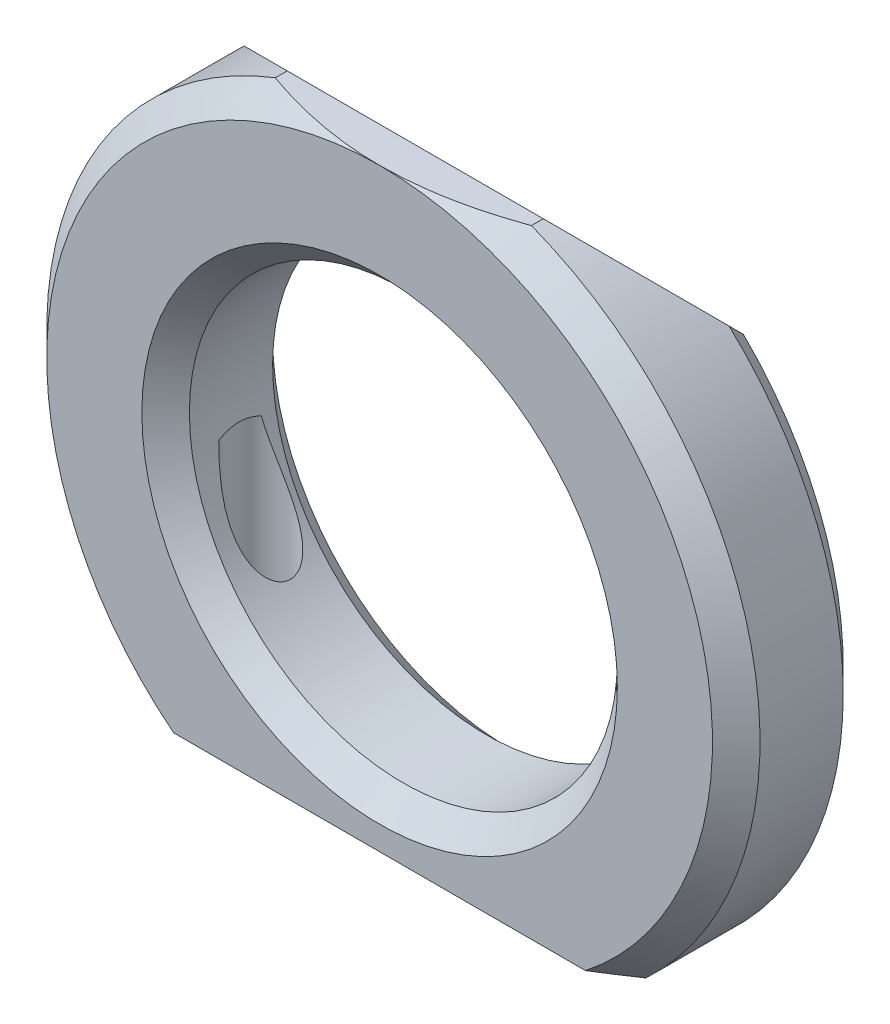
ISO-10303-21;
HEADER;
FILE_DESCRIPTION(('STEP AP214'),'2;1');
FILE_NAME('part.step','',(''),(''),'','','');
FILE_SCHEMA(('AUTOMOTIVE_DESIGN { 1 0 10303 214 1 1 1 1 }'));
ENDSEC;
DATA;
#1=APPLICATION_CONTEXT('core data for automotive mechanical design processes');
#2=APPLICATION_PROTOCOL_DEFINITION('international standard','automotive_design',2000,#1);
#3=PRODUCT_CONTEXT('',#1,'mechanical');
#4=PRODUCT('Part','Part','',(#3));
#5=PRODUCT_RELATED_PRODUCT_CATEGORY('part','',(#4));
#6=PRODUCT_DEFINITION_FORMATION('','',#4);
#7=PRODUCT_DEFINITION_CONTEXT('part definition',#1,'design');
#8=PRODUCT_DEFINITION('design','',#6,#7);
#9=PRODUCT_DEFINITION_SHAPE('','',#8);
#10=(LENGTH_UNIT() NAMED_UNIT(*) SI_UNIT(.MILLI.,.METRE.));
#11=(NAMED_UNIT(*) PLANE_ANGLE_UNIT() SI_UNIT($,.RADIAN.));
#12=(NAMED_UNIT(*) SI_UNIT($,.STERADIAN.) SOLID_ANGLE_UNIT());
#13=UNCERTAINTY_MEASURE_WITH_UNIT(LENGTH_MEASURE(1.E-05),#10,'distance_accuracy_value','');
#14=(GEOMETRIC_REPRESENTATION_CONTEXT(3) GLOBAL_UNCERTAINTY_ASSIGNED_CONTEXT((#13)) GLOBAL_UNIT_ASSIGNED_CONTEXT((#10,
#11,#12)) REPRESENTATION_CONTEXT('',''));
#15=CARTESIAN_POINT('',(0.,0.,0.));
#16=DIRECTION('',(0.,0.,1.));
#17=DIRECTION('',(1.,0.,0.));
#18=AXIS2_PLACEMENT_3D('',#15,#16,#17);
#19=CARTESIAN_POINT('',(0.,0.,-30.));
#20=DIRECTION('',(0.,0.,1.));
#21=DIRECTION('',(1.,0.,0.));
#22=AXIS2_PLACEMENT_3D('',#19,#20,#21);
#23=PLANE('',#22);
#24=DIRECTION('',(1.,0.,0.));
#25=VECTOR('',#24,1.);
#26=CARTESIAN_POINT('',(-15.,10.,-30.));
#27=LINE('',#26,#25);
#28=CARTESIAN_POINT('',(0.,10.,-30.));
#29=VERTEX_POINT('',#28);
#30=CARTESIAN_POINT('',(9.79795897113271,10.,-30.));
#31=VERTEX_POINT('',#30);
#32=EDGE_CURVE('E275',#29,#31,#27,.T.);
#33=ORIENTED_EDGE('',*,*,#32,.T.);
#34=CARTESIAN_POINT('',(0.,0.,-30.));
#35=DIRECTION('',(0.,0.,1.));
#36=DIRECTION('',(1.,0.,0.));
#37=AXIS2_PLACEMENT_3D('',#34,#35,#36);
#38=CIRCLE('',#37,14.);
#39=CARTESIAN_POINT('',(8.66025403784439,-11.,-30.));
#40=VERTEX_POINT('',#39);
#41=EDGE_CURVE('E68',#31,#40,#38,.F.);
#42=ORIENTED_EDGE('',*,*,#41,.T.);
#43=DIRECTION('',(1.,0.,0.));
#44=VECTOR('',#43,1.);
#45=CARTESIAN_POINT('',(-15.,-11.,-30.));
#46=LINE('',#45,#44);
#47=CARTESIAN_POINT('',(-8.66025403784439,-11.,-30.));
#48=VERTEX_POINT('',#47);
#49=EDGE_CURVE('E283',#48,#40,#46,.T.);
#50=ORIENTED_EDGE('',*,*,#49,.F.);
#51=CARTESIAN_POINT('',(-9.7979589711327,10.,-30.));
#52=VERTEX_POINT('',#51);
#53=EDGE_CURVE('E279',#48,#52,#38,.F.);
#54=ORIENTED_EDGE('',*,*,#53,.T.);
#55=EDGE_CURVE('E146',#52,#29,#27,.T.);
#56=ORIENTED_EDGE('',*,*,#55,.T.);
#57=CARTESIAN_POINT('',(0.,0.,-30.));
#58=DIRECTION('',(0.,0.,1.));
#59=DIRECTION('',(1.,0.,0.));
#60=AXIS2_PLACEMENT_3D('',#57,#58,#59);
#61=CIRCLE('',#60,10.);
#62=EDGE_CURVE('E284',#29,#29,#61,.T.);
#63=ORIENTED_EDGE('',*,*,#62,.T.);
#64=EDGE_LOOP('',(#33,#42,#50,#54,#56,#63));
#65=FACE_BOUND('',#64,.T.);
#66=ADVANCED_FACE('F39',(#65),#23,.F.);
#67=CARTESIAN_POINT('',(0.,0.,-23.));
#68=DIRECTION('',(0.,0.,-1.));
#69=DIRECTION('',(-1.,0.,0.));
#70=AXIS2_PLACEMENT_3D('',#67,#68,#69);
#71=CYLINDRICAL_SURFACE('',#70,15.);
#72=DIRECTION('',(0.,0.,-1.));
#73=VECTOR('',#72,1.);
#74=CARTESIAN_POINT('',(-5.38516480713448,14.,-23.));
#75=LINE('',#74,#73);
#76=CARTESIAN_POINT('',(-5.38516480713449,14.,-26.));
#77=VERTEX_POINT('',#76);
#78=CARTESIAN_POINT('',(-5.38516480713448,14.,-25.5));
#79=VERTEX_POINT('',#78);
#80=EDGE_CURVE('E138',#77,#79,#75,.F.);
#81=ORIENTED_EDGE('',*,*,#80,.F.);
#82=CARTESIAN_POINT('',(0.,0.,-40.));
#83=DIRECTION('',(0.,0.707106781186549,-0.707106781186546));
#84=DIRECTION('',(0.,-0.707106781186546,-0.707106781186549));
#85=AXIS2_PLACEMENT_3D('',#82,#83,#84);
#86=ELLIPSE('',#85,21.2132034355965,15.);
#87=CARTESIAN_POINT('',(-10.1980390271856,11.,-29.));
#88=VERTEX_POINT('',#87);
#89=EDGE_CURVE('E129',#88,#77,#86,.T.);
#90=ORIENTED_EDGE('',*,*,#89,.F.);
#91=CARTESIAN_POINT('',(0.,0.,-29.));
#92=DIRECTION('',(0.,0.,1.));
#93=DIRECTION('',(1.,0.,0.));
#94=AXIS2_PLACEMENT_3D('',#91,#92,#93);
#95=CIRCLE('',#94,15.);
#96=CARTESIAN_POINT('',(-10.1980390271856,-11.,-29.));
#97=VERTEX_POINT('',#96);
#98=EDGE_CURVE('E280',#88,#97,#95,.T.);
#99=ORIENTED_EDGE('',*,*,#98,.T.);
#100=DIRECTION('',(0.,0.,-1.));
#101=VECTOR('',#100,1.);
#102=CARTESIAN_POINT('',(-10.1980390271856,-11.,-23.));
#103=LINE('',#102,#101);
#104=CARTESIAN_POINT('',(-10.1980390271856,-11.,-25.5));
#105=VERTEX_POINT('',#104);
#106=EDGE_CURVE('E325',#97,#105,#103,.F.);
#107=ORIENTED_EDGE('',*,*,#106,.T.);
#108=CARTESIAN_POINT('',(0.,0.,-25.5));
#109=DIRECTION('',(0.,0.,-1.));
#110=DIRECTION('',(-1.,0.,0.));
#111=AXIS2_PLACEMENT_3D('',#108,#109,#110);
#112=CIRCLE('',#111,15.);
#113=EDGE_CURVE('E152',#105,#79,#112,.T.);
#114=ORIENTED_EDGE('',*,*,#113,.T.);
#115=EDGE_LOOP('',(#81,#90,#99,#107,#114));
#116=FACE_BOUND('',#115,.T.);
#117=ADVANCED_FACE('F149',(#116),#71,.T.);
#118=DIRECTION('',(0.,0.,-1.));
#119=VECTOR('',#118,1.);
#120=CARTESIAN_POINT('',(5.38516480713448,14.,-23.));
#121=LINE('',#120,#119);
#122=CARTESIAN_POINT('',(5.38516480713426,14.,-25.4999999999999));
#123=VERTEX_POINT('',#122);
#124=CARTESIAN_POINT('',(5.38516480713449,14.,-26.));
#125=VERTEX_POINT('',#124);
#126=EDGE_CURVE('E144',#123,#125,#121,.T.);
#127=ORIENTED_EDGE('',*,*,#126,.F.);
#128=CARTESIAN_POINT('',(10.1980390271856,-11.,-25.5));
#129=VERTEX_POINT('',#128);
#130=EDGE_CURVE('E319',#123,#129,#112,.T.);
#131=ORIENTED_EDGE('',*,*,#130,.T.);
#132=DIRECTION('',(0.,0.,-1.));
#133=VECTOR('',#132,1.);
#134=CARTESIAN_POINT('',(10.1980390271856,-11.,-23.));
#135=LINE('',#134,#133);
#136=CARTESIAN_POINT('',(10.1980390271856,-11.,-29.));
#137=VERTEX_POINT('',#136);
#138=EDGE_CURVE('E294',#129,#137,#135,.T.);
#139=ORIENTED_EDGE('',*,*,#138,.T.);
#140=CARTESIAN_POINT('',(10.1980390271856,11.,-29.));
#141=VERTEX_POINT('',#140);
#142=EDGE_CURVE('E317',#137,#141,#95,.T.);
#143=ORIENTED_EDGE('',*,*,#142,.T.);
#144=EDGE_CURVE('E60',#125,#141,#86,.T.);
#145=ORIENTED_EDGE('',*,*,#144,.F.);
#146=EDGE_LOOP('',(#127,#131,#139,#143,#145));
#147=FACE_BOUND('',#146,.T.);
#148=ADVANCED_FACE('F258',(#147),#71,.T.);
#149=CARTESIAN_POINT('',(0.,0.,-25.5));
#150=DIRECTION('',(0.,0.,-1.));
#151=DIRECTION('',(-1.,0.,0.));
#152=AXIS2_PLACEMENT_3D('',#149,#150,#151);
#153=CONICAL_SURFACE('',#152,15.,0.785398163397451);
#154=ORIENTED_EDGE('',*,*,#130,.F.);
#155=CARTESIAN_POINT('',(-10.3843680514917,14.,-27.9308662959946));
#156=CARTESIAN_POINT('',(-10.1269171871683,14.,-27.7775122950138));
#157=CARTESIAN_POINT('',(-9.86785019855801,14.,-27.6268331475164));
#158=CARTESIAN_POINT('',(-9.3461467282826,14.,-27.3316367501733));
#159=CARTESIAN_POINT('',(-9.08350936261582,14.,-27.1871210644018));
#160=CARTESIAN_POINT('',(-8.55336482481995,14.,-26.9045596205432));
#161=CARTESIAN_POINT('',(-8.28584201813982,14.,-26.7665430540074));
#162=CARTESIAN_POINT('',(-7.74676948699538,14.,-26.4986802005628));
#163=CARTESIAN_POINT('',(-7.47522003341123,14.,-26.3688333671142));
#164=CARTESIAN_POINT('',(-6.64429176511101,14.,-25.9887278535139));
#165=CARTESIAN_POINT('',(-6.07809587107598,14.,-25.7530439666259));
#166=CARTESIAN_POINT('',(-4.92783161458854,14.,-25.3323417845345));
#167=CARTESIAN_POINT('',(-4.34379599881697,14.,-25.1472362096368));
#168=CARTESIAN_POINT('',(-3.40296076713394,14.,-24.9037023218268));
#169=CARTESIAN_POINT('',(-3.05151477097841,14.,-24.8244871340841));
#170=CARTESIAN_POINT('',(-2.34389100823781,14.,-24.6906036693693));
#171=CARTESIAN_POINT('',(-1.9877130133003,14.,-24.6359365814793));
#172=CARTESIAN_POINT('',(-1.27538851938782,14.,-24.5535618390417));
#173=CARTESIAN_POINT('',(-0.919269139440067,14.,-24.5256219525075));
#174=CARTESIAN_POINT('',(-0.205925344515125,14.,-24.4969771886417));
#175=CARTESIAN_POINT('',(0.151299095220363,14.,-24.4962729259953));
#176=CARTESIAN_POINT('',(0.922556846134175,14.,-24.5242530851131));
#177=CARTESIAN_POINT('',(1.33642253399369,14.,-24.557714775489));
#178=CARTESIAN_POINT('',(2.15980830862994,14.,-24.6597200835714));
#179=CARTESIAN_POINT('',(2.56932749423286,14.,-24.7282708367717));
#180=CARTESIAN_POINT('',(3.38683586672437,14.,-24.898217842327));
#181=CARTESIAN_POINT('',(3.79473968352417,14.,-25.0000198832662));
#182=CARTESIAN_POINT('',(4.6022159229643,14.,-25.2319636859804));
#183=CARTESIAN_POINT('',(5.00178991647904,14.,-25.3621000503883));
#184=CARTESIAN_POINT('',(5.88420032867669,14.,-25.6794939505548));
#185=CARTESIAN_POINT('',(6.36477737518063,14.,-25.8729968618505));
#186=CARTESIAN_POINT('',(7.31319529810721,14.,-26.2892709679015));
#187=CARTESIAN_POINT('',(7.78102957365697,14.,-26.5120569961303));
#188=CARTESIAN_POINT('',(8.7064415409142,14.,-26.9815839506538));
#189=CARTESIAN_POINT('',(9.16397861980821,14.,-27.2284043024325));
#190=CARTESIAN_POINT('',(10.0684364217692,14.,-27.7404901204433));
#191=CARTESIAN_POINT('',(10.5153589560613,14.,-28.0057524090325));
#192=CARTESIAN_POINT('',(11.380117405527,14.,-28.5387497310158));
#193=CARTESIAN_POINT('',(11.7983563273755,14.,-28.8058342741395));
#194=CARTESIAN_POINT('',(12.62763822803,14.,-29.3509848846135));
#195=CARTESIAN_POINT('',(13.0386806251584,14.,-29.6290518337848));
#196=CARTESIAN_POINT('',(13.8510883049466,14.,-30.1918145491972));
#197=CARTESIAN_POINT('',(14.2525058716319,14.,-30.476435015354));
#198=CARTESIAN_POINT('',(14.8505779976222,14.,-30.9088398789647));
#199=CARTESIAN_POINT('',(15.0492341175817,14.,-31.0538679928635));
#200=CARTESIAN_POINT('',(15.4453002083513,14.,-31.3456081361208));
#201=CARTESIAN_POINT('',(15.6427102039398,14.,-31.4923201318317));
#202=CARTESIAN_POINT('',(15.8395447475407,14.,-31.6398007987148));
#203=B_SPLINE_CURVE_WITH_KNOTS('',3,(#155,#156,#157,#158,#159,#160,#161,#162,#163,#164,#165,
#166,#167,#168,#169,#170,#171,#172,#173,#174,#175,#176,#177,#178,#179,#180,#181,#182,#183,#184,
#185,#186,#187,#188,#189,#190,#191,#192,#193,#194,#195,#196,#197,#198,#199,#200,#201,#202),
.UNSPECIFIED.,.F.,.F.,(4,2,2,2,2,2,2,2,2,2,2,2,2,2,2,2,2,2,2,2,2,2,2,4),(0.,0.89900299667121,
1.79823278814779,2.70117707457459,3.60406089134636,5.44207337166867,7.27689378995968,
8.35693786685017,9.43703425420614,10.5076580981922,11.5783061052444,12.8223202487414,
14.0665874677855,15.3266451716974,16.586463058584,18.1394146878946,19.6931560244026,
21.2522184662186,22.8110129359759,24.299539832894,25.7881864935131,27.2643288361211,
28.0022082628102,28.7400729706603),.UNSPECIFIED.);
#204=CARTESIAN_POINT('',(0.,14.,-24.5));
#205=VERTEX_POINT('',#204);
#206=EDGE_CURVE('E12',#123,#205,#203,.F.);
#207=ORIENTED_EDGE('',*,*,#206,.T.);
#208=CARTESIAN_POINT('',(0.,0.,-24.5));
#209=DIRECTION('',(0.,0.,-1.));
#210=DIRECTION('',(-1.,0.,0.));
#211=AXIS2_PLACEMENT_3D('',#208,#209,#210);
#212=CIRCLE('',#211,14.);
#213=CARTESIAN_POINT('',(8.66025403784439,-11.,-24.5));
#214=VERTEX_POINT('',#213);
#215=EDGE_CURVE('E299',#214,#205,#212,.F.);
#216=ORIENTED_EDGE('',*,*,#215,.F.);
#217=CARTESIAN_POINT('',(10.1980390271856,-11.,-25.5));
#218=CARTESIAN_POINT('',(10.0716097932226,-11.,-25.4140465014491));
#219=CARTESIAN_POINT('',(9.94478168559514,-11.,-25.3286777286267));
#220=CARTESIAN_POINT('',(9.69029386318123,-11.,-25.1592213451996));
#221=CARTESIAN_POINT('',(9.56263424634969,-11.,-25.0751335874483));
#222=CARTESIAN_POINT('',(9.30641873923805,-11.,-24.908329983576));
#223=CARTESIAN_POINT('',(9.17786283805277,-11.,-24.8256141541888));
#224=CARTESIAN_POINT('',(8.91978924484244,-11.,-24.6616638992506));
#225=CARTESIAN_POINT('',(8.79027144318523,-11.,-24.5804296463243));
#226=CARTESIAN_POINT('',(8.66025403784439,-11.,-24.5));
#227=B_SPLINE_CURVE_WITH_KNOTS('',3,(#217,#218,#219,#220,#221,#222,#223,#224,#225,#226),
.UNSPECIFIED.,.F.,.F.,(4,2,2,2,4),(0.,0.458640555019234,0.917228023923435,1.3758210822705,
1.83446723618274),.UNSPECIFIED.);
#228=EDGE_CURVE('E247',#129,#214,#227,.T.);
#229=ORIENTED_EDGE('',*,*,#228,.F.);
#230=EDGE_LOOP('',(#154,#207,#216,#229));
#231=FACE_BOUND('',#230,.T.);
#232=ADVANCED_FACE('F253',(#231),#153,.T.);
#233=CARTESIAN_POINT('',(-8.66025403784439,-11.,-24.5));
#234=VERTEX_POINT('',#233);
#235=EDGE_CURVE('E301',#205,#234,#212,.F.);
#236=ORIENTED_EDGE('',*,*,#235,.F.);
#237=EDGE_CURVE('E43',#205,#79,#203,.F.);
#238=ORIENTED_EDGE('',*,*,#237,.T.);
#239=ORIENTED_EDGE('',*,*,#113,.F.);
#240=CARTESIAN_POINT('',(-8.66025403784439,-11.,-24.5));
#241=CARTESIAN_POINT('',(-8.79027144318523,-11.,-24.5804296463243));
#242=CARTESIAN_POINT('',(-8.91978924484244,-11.,-24.6616638992506));
#243=CARTESIAN_POINT('',(-9.17786283805277,-11.,-24.8256141541888));
#244=CARTESIAN_POINT('',(-9.30641873923805,-11.,-24.908329983576));
#245=CARTESIAN_POINT('',(-9.56263424634969,-11.,-25.0751335874483));
#246=CARTESIAN_POINT('',(-9.69029386318122,-11.,-25.1592213451996));
#247=CARTESIAN_POINT('',(-9.94478168559514,-11.,-25.3286777286267));
#248=CARTESIAN_POINT('',(-10.0716097932226,-11.,-25.4140465014491));
#249=CARTESIAN_POINT('',(-10.1980390271856,-11.,-25.5));
#250=B_SPLINE_CURVE_WITH_KNOTS('',3,(#240,#241,#242,#243,#244,#245,#246,#247,#248,#249),
.UNSPECIFIED.,.F.,.F.,(4,2,2,2,4),(0.,0.458646153912242,0.917239212259307,1.37582668116351,
1.83446723618274),.UNSPECIFIED.);
#251=EDGE_CURVE('E242',#234,#105,#250,.T.);
#252=ORIENTED_EDGE('',*,*,#251,.F.);
#253=EDGE_LOOP('',(#236,#238,#239,#252));
#254=FACE_BOUND('',#253,.T.);
#255=ADVANCED_FACE('F257',(#254),#153,.T.);
#256=CARTESIAN_POINT('',(0.,0.,-29.));
#257=DIRECTION('',(0.,0.,1.));
#258=DIRECTION('',(1.,0.,0.));
#259=AXIS2_PLACEMENT_3D('',#256,#257,#258);
#260=CONICAL_SURFACE('',#259,15.,0.785398163397451);
#261=ORIENTED_EDGE('',*,*,#98,.F.);
#262=CARTESIAN_POINT('',(-10.1981174733379,11.0002,-28.9998));
#263=CARTESIAN_POINT('',(-10.1326469523447,10.8332194256279,-29.1667805743721));
#264=CARTESIAN_POINT('',(-10.0665583538846,10.6663624915091,-29.3336375084909));
#265=CARTESIAN_POINT('',(-9.93314497040287,10.3328958247252,-29.6671041752748));
#266=CARTESIAN_POINT('',(-9.86582018479521,10.1662860921773,-29.8337139078227));
#267=CARTESIAN_POINT('',(-9.79787732113452,9.99979999999999,-30.0002));
#268=B_SPLINE_CURVE_WITH_KNOTS('',3,(#262,#263,#264,#265,#266,#267),.UNSPECIFIED.,.F.,.F.,(4,2,
4),(0.,0.735154121229797,1.47030859101714),.UNSPECIFIED.);
#269=EDGE_CURVE('E134',#88,#52,#268,.T.);
#270=ORIENTED_EDGE('',*,*,#269,.T.);
#271=ORIENTED_EDGE('',*,*,#53,.F.);
#272=CARTESIAN_POINT('',(-10.1980390271856,-11.,-29.));
#273=CARTESIAN_POINT('',(-10.0716097932226,-11.,-29.0859534985509));
#274=CARTESIAN_POINT('',(-9.94478168559514,-11.,-29.1713222713733));
#275=CARTESIAN_POINT('',(-9.69029386318123,-11.,-29.3407786548004));
#276=CARTESIAN_POINT('',(-9.56263424634969,-11.,-29.4248664125517));
#277=CARTESIAN_POINT('',(-9.30641873923805,-11.,-29.591670016424));
#278=CARTESIAN_POINT('',(-9.17786283805277,-11.,-29.6743858458112));
#279=CARTESIAN_POINT('',(-8.91978924484244,-11.,-29.8383361007494));
#280=CARTESIAN_POINT('',(-8.79027144318522,-11.,-29.9195703536757));
#281=CARTESIAN_POINT('',(-8.66025403784439,-11.,-30.));
#282=B_SPLINE_CURVE_WITH_KNOTS('',3,(#272,#273,#274,#275,#276,#277,#278,#279,#280,#281),
.UNSPECIFIED.,.F.,.F.,(4,2,2,2,4),(0.,0.458640555019234,0.917228023923435,1.3758210822705,
1.83446723618274),.UNSPECIFIED.);
#283=EDGE_CURVE('E236',#97,#48,#282,.T.);
#284=ORIENTED_EDGE('',*,*,#283,.F.);
#285=EDGE_LOOP('',(#261,#270,#271,#284));
#286=FACE_BOUND('',#285,.T.);
#287=ADVANCED_FACE('F260',(#286),#260,.T.);
#288=ORIENTED_EDGE('',*,*,#41,.F.);
#289=CARTESIAN_POINT('',(9.7978773211344,9.99980000000001,-30.0002));
#290=CARTESIAN_POINT('',(9.86582018479513,10.1662860921773,-29.8337139078227));
#291=CARTESIAN_POINT('',(9.93314497040283,10.3328958247252,-29.6671041752748));
#292=CARTESIAN_POINT('',(10.0665583538846,10.6663624915091,-29.3336375084909));
#293=CARTESIAN_POINT('',(10.1326469523448,10.8332194256279,-29.1667805743721));
#294=CARTESIAN_POINT('',(10.198117473338,11.0002,-28.9998));
#295=B_SPLINE_CURVE_WITH_KNOTS('',3,(#289,#290,#291,#292,#293,#294),.UNSPECIFIED.,.F.,.F.,(4,2,
4),(0.,0.735154469787337,1.47030859101714),.UNSPECIFIED.);
#296=EDGE_CURVE('E145',#31,#141,#295,.T.);
#297=ORIENTED_EDGE('',*,*,#296,.T.);
#298=ORIENTED_EDGE('',*,*,#142,.F.);
#299=CARTESIAN_POINT('',(8.66025403784439,-11.,-30.));
#300=CARTESIAN_POINT('',(8.79027144318522,-11.,-29.9195703536757));
#301=CARTESIAN_POINT('',(8.91978924484244,-11.,-29.8383361007494));
#302=CARTESIAN_POINT('',(9.17786283805277,-11.,-29.6743858458112));
#303=CARTESIAN_POINT('',(9.30641873923805,-11.,-29.591670016424));
#304=CARTESIAN_POINT('',(9.56263424634969,-11.,-29.4248664125517));
#305=CARTESIAN_POINT('',(9.69029386318123,-11.,-29.3407786548004));
#306=CARTESIAN_POINT('',(9.94478168559515,-11.,-29.1713222713733));
#307=CARTESIAN_POINT('',(10.0716097932226,-11.,-29.0859534985509));
#308=CARTESIAN_POINT('',(10.1980390271856,-11.,-29.));
#309=B_SPLINE_CURVE_WITH_KNOTS('',3,(#299,#300,#301,#302,#303,#304,#305,#306,#307,#308),
.UNSPECIFIED.,.F.,.F.,(4,2,2,2,4),(0.,0.458646153912241,0.917239212259307,1.37582668116351,
1.83446723618274),.UNSPECIFIED.);
#310=EDGE_CURVE('E227',#40,#137,#309,.T.);
#311=ORIENTED_EDGE('',*,*,#310,.F.);
#312=EDGE_LOOP('',(#288,#297,#298,#311));
#313=FACE_BOUND('',#312,.T.);
#314=ADVANCED_FACE('F221',(#313),#260,.T.);
#315=CARTESIAN_POINT('',(-15.,-11.,-24.5));
#316=DIRECTION('',(0.,1.,0.));
#317=DIRECTION('',(0.,0.,1.));
#318=AXIS2_PLACEMENT_3D('',#315,#316,#317);
#319=PLANE('',#318);
#320=CARTESIAN_POINT('',(-8.,-11.,-27.5));
#321=DIRECTION('',(0.,-1.,0.));
#322=DIRECTION('',(0.,0.,-1.));
#323=AXIS2_PLACEMENT_3D('',#320,#321,#322);
#324=CIRCLE('',#323,1.24999999999999);
#325=CARTESIAN_POINT('',(-8.,-11.,-28.75));
#326=VERTEX_POINT('',#325);
#327=EDGE_CURVE('E335',#326,#326,#324,.T.);
#328=ORIENTED_EDGE('',*,*,#327,.F.);
#329=EDGE_LOOP('',(#328));
#330=FACE_BOUND('',#329,.T.);
#331=CARTESIAN_POINT('',(8.,-11.,-27.5));
#332=DIRECTION('',(0.,-1.,0.));
#333=DIRECTION('',(0.,0.,-1.));
#334=AXIS2_PLACEMENT_3D('',#331,#332,#333);
#335=CIRCLE('',#334,1.24999999999999);
#336=CARTESIAN_POINT('',(8.,-11.,-28.75));
#337=VERTEX_POINT('',#336);
#338=EDGE_CURVE('E330',#337,#337,#335,.T.);
#339=ORIENTED_EDGE('',*,*,#338,.F.);
#340=EDGE_LOOP('',(#339));
#341=FACE_BOUND('',#340,.T.);
#342=ORIENTED_EDGE('',*,*,#138,.F.);
#343=ORIENTED_EDGE('',*,*,#228,.T.);
#344=DIRECTION('',(1.,0.,0.));
#345=VECTOR('',#344,1.);
#346=CARTESIAN_POINT('',(-15.,-11.,-24.5));
#347=LINE('',#346,#345);
#348=EDGE_CURVE('E291',#234,#214,#347,.T.);
#349=ORIENTED_EDGE('',*,*,#348,.F.);
#350=ORIENTED_EDGE('',*,*,#251,.T.);
#351=ORIENTED_EDGE('',*,*,#106,.F.);
#352=ORIENTED_EDGE('',*,*,#283,.T.);
#353=ORIENTED_EDGE('',*,*,#49,.T.);
#354=ORIENTED_EDGE('',*,*,#310,.T.);
#355=EDGE_LOOP('',(#342,#343,#349,#350,#351,#352,#353,#354));
#356=FACE_BOUND('',#355,.T.);
#357=ADVANCED_FACE('F216',(#330,#341,#356),#319,.F.);
#358=CARTESIAN_POINT('',(8.,-1.50000000000002,-27.5));
#359=DIRECTION('',(0.,-1.,0.));
#360=DIRECTION('',(0.,0.,-1.));
#361=AXIS2_PLACEMENT_3D('',#358,#359,#360);
#362=CONICAL_SURFACE('',#361,1.25,1.02974425867665);
#363=CARTESIAN_POINT('',(8.,-1.50000000000002,-27.5));
#364=DIRECTION('',(0.,-1.,0.));
#365=DIRECTION('',(0.,0.,-1.));
#366=AXIS2_PLACEMENT_3D('',#363,#364,#365);
#367=CIRCLE('',#366,1.25);
#368=CARTESIAN_POINT('',(8.87411967464942,-1.50000000000002,-28.3935405947078));
#369=VERTEX_POINT('',#368);
#370=CARTESIAN_POINT('',(8.87411967464942,-1.50000000000002,-26.6064594052922));
#371=VERTEX_POINT('',#370);
#372=EDGE_CURVE('E302',#369,#371,#367,.T.);
#373=ORIENTED_EDGE('',*,*,#372,.T.);
#374=CARTESIAN_POINT('',(8.86106122519498,-1.57530757737848,-26.4275663046257));
#375=CARTESIAN_POINT('',(8.86361566752957,-1.56094003834773,-26.4602890018099));
#376=CARTESIAN_POINT('',(8.86609058147292,-1.54681453610574,-26.4931239838151));
#377=CARTESIAN_POINT('',(8.87087174635954,-1.51915470452756,-26.559063843349));
#378=CARTESIAN_POINT('',(8.87317795349055,-1.5056205291207,-26.5921687885222));
#379=CARTESIAN_POINT('',(8.87984990162628,-1.4659415614311,-26.6922721352683));
#380=CARTESIAN_POINT('',(8.88394254666435,-1.4408700172651,-26.7597241566238));
#381=CARTESIAN_POINT('',(8.89123578849562,-1.39515452702232,-26.8953921180772));
#382=CARTESIAN_POINT('',(8.89444536076115,-1.37446656409503,-26.9635924372257));
#383=CARTESIAN_POINT('',(8.8998432520033,-1.33907222296339,-27.1014942553577));
#384=CARTESIAN_POINT('',(8.90203360474662,-1.32435394036727,-27.1711924719693));
#385=CARTESIAN_POINT('',(8.90480765394282,-1.30555302442072,-27.2946804252001));
#386=CARTESIAN_POINT('',(8.90565312498818,-1.29975056316816,-27.3481970376761));
#387=CARTESIAN_POINT('',(8.90658287025973,-1.29336510130989,-27.4555565941321));
#388=CARTESIAN_POINT('',(8.90666721269013,-1.2927816330338,-27.5093995084397));
#389=CARTESIAN_POINT('',(8.90606712586658,-1.29690857674494,-27.6169138398362));
#390=CARTESIAN_POINT('',(8.90538206378273,-1.30162334649805,-27.6705850792886));
#391=CARTESIAN_POINT('',(8.90329669120279,-1.31581070616334,-27.777277081794));
#392=CARTESIAN_POINT('',(8.90189613544496,-1.32528492753385,-27.8302976154076));
#393=CARTESIAN_POINT('',(8.89823890619905,-1.34963458663474,-27.9424520793815));
#394=CARTESIAN_POINT('',(8.89589311023684,-1.36506099471586,-28.0014606615901));
#395=CARTESIAN_POINT('',(8.8905197062628,-1.39963051090123,-28.1183604287142));
#396=CARTESIAN_POINT('',(8.88749165652942,-1.41877602580943,-28.1762508632087));
#397=CARTESIAN_POINT('',(8.88085338113834,-1.45975044087702,-28.2910586983109));
#398=CARTESIAN_POINT('',(8.87724283945837,-1.48158079611952,-28.3479755520721));
#399=CARTESIAN_POINT('',(8.86951569004325,-1.52716672313604,-28.4608468301184));
#400=CARTESIAN_POINT('',(8.8654002893288,-1.55091765852062,-28.5168031989002));
#401=CARTESIAN_POINT('',(8.86106122519498,-1.57530757737846,-28.5724336953742));
#402=B_SPLINE_CURVE_WITH_KNOTS('',3,(#374,#375,#376,#377,#378,#379,#380,#381,#382,#383,#384,
#385,#386,#387,#388,#389,#390,#391,#392,#393,#394,#395,#396,#397,#398,#399,#400,#401),
.UNSPECIFIED.,.F.,.F.,(4,2,2,2,2,2,2,2,2,2,2,2,2,4),(0.,0.107484795997813,0.21499740685303,
0.43112518645645,0.644967483157521,0.858381226150281,1.01966031237344,1.18092494634404,
1.34232231655745,1.50377504880878,1.68671209699813,1.86976792889765,2.05292341105545,
2.23564923905379),.UNSPECIFIED.);
#403=EDGE_CURVE('E199',#371,#369,#402,.T.);
#404=ORIENTED_EDGE('',*,*,#403,.T.);
#405=EDGE_LOOP('',(#373,#404));
#406=FACE_BOUND('',#405,.T.);
#407=ADVANCED_FACE('F210',(#406),#362,.F.);
#408=CARTESIAN_POINT('',(8.,-11.,-27.5));
#409=DIRECTION('',(0.,-1.,0.));
#410=DIRECTION('',(0.,0.,-1.));
#411=AXIS2_PLACEMENT_3D('',#408,#409,#410);
#412=CYLINDRICAL_SURFACE('',#411,1.24999999999999);
#413=ORIENTED_EDGE('',*,*,#372,.F.);
#414=CARTESIAN_POINT('',(8.87411967464942,-1.50000000000002,-28.3935405947078));
#415=CARTESIAN_POINT('',(8.85708328523695,-1.6007755749857,-28.4102155974332));
#416=CARTESIAN_POINT('',(8.83835554615178,-1.70113872994846,-28.4275735857014));
#417=CARTESIAN_POINT('',(8.79752008243259,-1.90106765132002,-28.4629054350056));
#418=CARTESIAN_POINT('',(8.77541232661505,-2.00063341036326,-28.4808793017224));
#419=CARTESIAN_POINT('',(8.70385384490105,-2.29888060983939,-28.5347268180978));
#420=CARTESIAN_POINT('',(8.64928941017002,-2.49639332409706,-28.5703967028258));
#421=CARTESIAN_POINT('',(8.52431976444913,-2.89500688881718,-28.6370109661542));
#422=CARTESIAN_POINT('',(8.45342967450551,-3.09599366382335,-28.6677478792078));
#423=CARTESIAN_POINT('',(8.33615429625324,-3.3940998035778,-28.7046459380422));
#424=CARTESIAN_POINT('',(8.29527458916372,-3.49283190549684,-28.7154060168352));
#425=CARTESIAN_POINT('',(8.2098894739385,-3.68905915831004,-28.7330239431371));
#426=CARTESIAN_POINT('',(8.165384906513,-3.78655458999567,-28.7398826925479));
#427=CARTESIAN_POINT('',(8.07334229593198,-3.97899370523011,-28.7486931227266));
#428=CARTESIAN_POINT('',(8.02584402675978,-4.07395375798958,-28.7506991573559));
#429=CARTESIAN_POINT('',(7.92754897671645,-4.26206757611571,-28.7488663624839));
#430=CARTESIAN_POINT('',(7.87675363631021,-4.35522210750634,-28.7450300692132));
#431=CARTESIAN_POINT('',(7.77263043180039,-4.53841490538821,-28.7302615672639));
#432=CARTESIAN_POINT('',(7.71933055222094,-4.62847411161763,-28.719395762287));
#433=CARTESIAN_POINT('',(7.61033057764768,-4.80558597309028,-28.6890572263881));
#434=CARTESIAN_POINT('',(7.55463293321618,-4.8926415414956,-28.6695931030931));
#435=CARTESIAN_POINT('',(7.44756877966817,-5.05391844926578,-28.6226632925019));
#436=CARTESIAN_POINT('',(7.39635182913236,-5.12853471600345,-28.5962362484831));
#437=CARTESIAN_POINT('',(7.29368403850661,-5.27352499250148,-28.5330814793777));
#438=CARTESIAN_POINT('',(7.24223293142836,-5.34388880825062,-28.4963301090838));
#439=CARTESIAN_POINT('',(7.14041748909151,-5.47920538204426,-28.410022795025));
#440=CARTESIAN_POINT('',(7.09007655919198,-5.54407417126059,-28.3603037744454));
#441=CARTESIAN_POINT('',(6.99454613026873,-5.66411052189057,-28.2463480666901));
#442=CARTESIAN_POINT('',(6.9493351104457,-5.71931918149558,-28.1821756772732));
#443=CARTESIAN_POINT('',(6.88612727722796,-5.79504770014483,-28.0692245541152));
#444=CARTESIAN_POINT('',(6.86473990234609,-5.82032815276168,-28.0255268342084));
#445=CARTESIAN_POINT('',(6.82648544946824,-5.86514780552809,-27.9334098844887));
#446=CARTESIAN_POINT('',(6.80961591930785,-5.88469012074157,-27.8849932355279));
#447=CARTESIAN_POINT('',(6.78152083944794,-5.91704711501855,-27.7838699958307));
#448=CARTESIAN_POINT('',(6.77034490696607,-5.92980269185769,-27.7311301908117));
#449=CARTESIAN_POINT('',(6.75491526698757,-5.94737446502618,-27.6233593114046));
#450=CARTESIAN_POINT('',(6.75065590871298,-5.95219714250368,-27.5683301451443));
#451=CARTESIAN_POINT('',(6.74955513456626,-5.95344450624295,-27.4648082390818));
#452=CARTESIAN_POINT('',(6.75187693980968,-5.95081651701455,-27.4163319430734));
#453=CARTESIAN_POINT('',(6.76198982631269,-5.93932246663234,-27.3207202606378));
#454=CARTESIAN_POINT('',(6.76978083127581,-5.9304564924997,-27.2735848555144));
#455=CARTESIAN_POINT('',(6.79002457882441,-5.90726615786427,-27.1828609147258));
#456=CARTESIAN_POINT('',(6.8023758992209,-5.89306043839874,-27.1392186533023));
#457=CARTESIAN_POINT('',(6.83098204361698,-5.85987754338299,-27.0551726476339));
#458=CARTESIAN_POINT('',(6.8472383828719,-5.84089851552241,-27.0147701686514));
#459=CARTESIAN_POINT('',(6.89099309420711,-5.78928397123099,-26.9199698019241));
#460=CARTESIAN_POINT('',(6.92023406769393,-5.75437107560637,-26.8676133155812));
#461=CARTESIAN_POINT('',(6.98303449192455,-5.67800065704733,-26.7708737998814));
#462=CARTESIAN_POINT('',(7.01660350986967,-5.63652858749242,-26.72650897323));
#463=CARTESIAN_POINT('',(7.10285868224077,-5.52776561919175,-26.6259989700178));
#464=CARTESIAN_POINT('',(7.15704001136858,-5.45758009537778,-26.5742951459052));
#465=CARTESIAN_POINT('',(7.26713457811662,-5.31011174866885,-26.4848869012029));
#466=CARTESIAN_POINT('',(7.32305098128383,-5.23281537827303,-26.447209923295));
#467=CARTESIAN_POINT('',(7.42535836799345,-5.0863252750604,-26.3886198267418));
#468=CARTESIAN_POINT('',(7.4718225643357,-5.01785227997352,-26.3659784714355));
#469=CARTESIAN_POINT('',(7.56368795346398,-4.87827946301278,-26.3275610278762));
#470=CARTESIAN_POINT('',(7.60908838989865,-4.80717785952706,-26.3117896920706));
#471=CARTESIAN_POINT('',(7.69836049844633,-4.66288066996903,-26.2860502466067));
#472=CARTESIAN_POINT('',(7.74222996682389,-4.58968232091245,-26.2760902022262));
#473=CARTESIAN_POINT('',(7.82808011145286,-4.44167660634974,-26.2611133040344));
#474=CARTESIAN_POINT('',(7.87006007410449,-4.36686864845668,-26.2560983030882));
#475=CARTESIAN_POINT('',(7.98762681311368,-4.1501344551804,-26.2476960913835));
#476=CARTESIAN_POINT('',(8.06059241842558,-4.00657252613277,-26.2495430598587));
#477=CARTESIAN_POINT('',(8.19854202015398,-3.71615674617172,-26.2639233429438));
#478=CARTESIAN_POINT('',(8.26351866126316,-3.56930000668576,-26.2764664222273));
#479=CARTESIAN_POINT('',(8.38539505310234,-3.27275175073386,-26.3092198048271));
#480=CARTESIAN_POINT('',(8.44227613290657,-3.12305455565661,-26.3294474495327));
#481=CARTESIAN_POINT('',(8.5477447019725,-2.8216230660789,-26.3749352586297));
#482=CARTESIAN_POINT('',(8.59633544743443,-2.66988959674315,-26.4001934386868));
#483=CARTESIAN_POINT('',(8.68968149811894,-2.34945933835957,-26.4559350073354));
#484=CARTESIAN_POINT('',(8.73358915250647,-2.18056229674849,-26.4866879880508));
#485=CARTESIAN_POINT('',(8.79192570677171,-1.92602135509888,-26.5325487115759));
#486=CARTESIAN_POINT('',(8.81007421561503,-1.84122871737723,-26.5477460891529));
#487=CARTESIAN_POINT('',(8.84392954208174,-1.67105705152311,-26.5776148593848));
#488=CARTESIAN_POINT('',(8.85963612317073,-1.58567796742057,-26.59228620098));
#489=CARTESIAN_POINT('',(8.87411967464942,-1.50000000000002,-26.6064594052922));
#490=B_SPLINE_CURVE_WITH_KNOTS('',3,(#414,#415,#416,#417,#418,#419,#420,#421,#422,#423,#424,
#425,#426,#427,#428,#429,#430,#431,#432,#433,#434,#435,#436,#437,#438,#439,#440,#441,#442,#443,
#444,#445,#446,#447,#448,#449,#450,#451,#452,#453,#454,#455,#456,#457,#458,#459,#460,#461,#462,
#463,#464,#465,#466,#467,#468,#469,#470,#471,#472,#473,#474,#475,#476,#477,#478,#479,#480,#481,
#482,#483,#484,#485,#486,#487,#488,#489),.UNSPECIFIED.,.F.,.F.,(4,2,2,2,2,2,2,2,2,2,2,2,2,2,2,2,
2,2,2,2,2,2,2,2,2,2,2,2,2,2,2,2,2,2,2,2,2,4),(0.,0.310631637156385,0.621266140325088,
1.24475142220558,1.8899184443281,2.21200932792036,2.53402572086116,2.85241825048372,
3.17067260115902,3.48596363908503,3.80093975738901,4.08326410499949,4.36624039028637,
4.65296296322747,4.93843435963055,5.10234609950026,5.26616869135074,5.43139550026636,
5.59648725234872,5.74156233820096,5.88663540026624,6.028659314912,6.17073842803876,
6.37774327121526,6.58521380903381,6.89141847932309,7.19821911110901,7.4552312436013,
7.71242088714413,7.96996663086809,8.22760883812741,8.70995030699621,9.19273258613571,
9.67661087138331,10.1602986637118,10.6915726954795,10.955645804923,11.2197444775744),.UNSPECIFIED.);
#491=EDGE_CURVE('E192',#369,#371,#490,.T.);
#492=ORIENTED_EDGE('',*,*,#491,.T.);
#493=EDGE_LOOP('',(#413,#492));
#494=FACE_BOUND('',#493,.T.);
#495=ORIENTED_EDGE('',*,*,#338,.T.);
#496=EDGE_LOOP('',(#495));
#497=FACE_BOUND('',#496,.T.);
#498=ADVANCED_FACE('F206',(#494,#497),#412,.F.);
#499=CARTESIAN_POINT('',(-8.,-1.50000000000002,-27.5));
#500=DIRECTION('',(0.,-1.,0.));
#501=DIRECTION('',(0.,0.,-1.));
#502=AXIS2_PLACEMENT_3D('',#499,#500,#501);
#503=CONICAL_SURFACE('',#502,1.25,1.02974425867665);
#504=CARTESIAN_POINT('',(-8.,-1.50000000000002,-27.5));
#505=DIRECTION('',(0.,-1.,0.));
#506=DIRECTION('',(0.,0.,-1.));
#507=AXIS2_PLACEMENT_3D('',#504,#505,#506);
#508=CIRCLE('',#507,1.25);
#509=CARTESIAN_POINT('',(-8.87411967464942,-1.50000000000002,-26.6064594052922));
#510=VERTEX_POINT('',#509);
#511=CARTESIAN_POINT('',(-8.87411967464942,-1.50000000000002,-28.3935405947078));
#512=VERTEX_POINT('',#511);
#513=EDGE_CURVE('E333',#510,#512,#508,.T.);
#514=ORIENTED_EDGE('',*,*,#513,.T.);
#515=CARTESIAN_POINT('',(-8.86106122519498,-1.57530757737846,-28.5724336953742));
#516=CARTESIAN_POINT('',(-8.86361566752957,-1.56094003834771,-28.5397109981901));
#517=CARTESIAN_POINT('',(-8.86609058147292,-1.54681453610573,-28.5068760161848));
#518=CARTESIAN_POINT('',(-8.87087174635954,-1.51915470452754,-28.440936156651));
#519=CARTESIAN_POINT('',(-8.87317795349055,-1.50562052912068,-28.4078312114778));
#520=CARTESIAN_POINT('',(-8.87984990162628,-1.46594156143109,-28.3077278647317));
#521=CARTESIAN_POINT('',(-8.88394254666436,-1.44087001726509,-28.2402758433762));
#522=CARTESIAN_POINT('',(-8.89123578849562,-1.3951545270223,-28.1046078819227));
#523=CARTESIAN_POINT('',(-8.89444536076115,-1.37446656409502,-28.0364075627743));
#524=CARTESIAN_POINT('',(-8.8998432520033,-1.33907222296338,-27.8985057446422));
#525=CARTESIAN_POINT('',(-8.90203360474662,-1.32435394036726,-27.8288075280307));
#526=CARTESIAN_POINT('',(-8.90480765394282,-1.30555302442071,-27.7053195747999));
#527=CARTESIAN_POINT('',(-8.90565312498818,-1.29975056316816,-27.6518029623239));
#528=CARTESIAN_POINT('',(-8.90658287025973,-1.29336510130989,-27.5444434058679));
#529=CARTESIAN_POINT('',(-8.90666721269013,-1.2927816330338,-27.4906004915603));
#530=CARTESIAN_POINT('',(-8.90606712586657,-1.29690857674494,-27.3830861601638));
#531=CARTESIAN_POINT('',(-8.90538206378273,-1.30162334649806,-27.3294149207114));
#532=CARTESIAN_POINT('',(-8.90329669120279,-1.31581070616334,-27.222722918206));
#533=CARTESIAN_POINT('',(-8.90189613544496,-1.32528492753385,-27.1697023845924));
#534=CARTESIAN_POINT('',(-8.89823890619905,-1.34963458663475,-27.0575479206184));
#535=CARTESIAN_POINT('',(-8.89589311023684,-1.36506099471587,-26.9985393384099));
#536=CARTESIAN_POINT('',(-8.8905197062628,-1.39963051090124,-26.8816395712858));
#537=CARTESIAN_POINT('',(-8.88749165652942,-1.41877602580945,-26.8237491367913));
#538=CARTESIAN_POINT('',(-8.88085338113834,-1.45975044087703,-26.708941301689));
#539=CARTESIAN_POINT('',(-8.87724283945837,-1.48158079611954,-26.6520244479279));
#540=CARTESIAN_POINT('',(-8.86951569004325,-1.52716672313605,-26.5391531698816));
#541=CARTESIAN_POINT('',(-8.86540028932879,-1.55091765852064,-26.4831968010997));
#542=CARTESIAN_POINT('',(-8.86106122519498,-1.57530757737848,-26.4275663046257));
#543=B_SPLINE_CURVE_WITH_KNOTS('',3,(#515,#516,#517,#518,#519,#520,#521,#522,#523,#524,#525,
#526,#527,#528,#529,#530,#531,#532,#533,#534,#535,#536,#537,#538,#539,#540,#541,#542),
.UNSPECIFIED.,.F.,.F.,(4,2,2,2,2,2,2,2,2,2,2,2,2,4),(0.,0.107484795997809,0.214997406853026,
0.431125186456445,0.644967483157522,0.85838122615027,1.01966031237343,1.18092494634404,
1.34232231655745,1.50377504880878,1.68671209699812,1.86976792889765,2.05292341105545,
2.23564923905379),.UNSPECIFIED.);
#544=EDGE_CURVE('E171',#512,#510,#543,.T.);
#545=ORIENTED_EDGE('',*,*,#544,.T.);
#546=EDGE_LOOP('',(#514,#545));
#547=FACE_BOUND('',#546,.T.);
#548=ADVANCED_FACE('F209',(#547),#503,.F.);
#549=CARTESIAN_POINT('',(-8.,-11.,-27.5));
#550=DIRECTION('',(0.,-1.,0.));
#551=DIRECTION('',(0.,0.,-1.));
#552=AXIS2_PLACEMENT_3D('',#549,#550,#551);
#553=CYLINDRICAL_SURFACE('',#552,1.24999999999999);
#554=ORIENTED_EDGE('',*,*,#513,.F.);
#555=CARTESIAN_POINT('',(-8.87411967464942,-1.50000000000002,-26.6064594052922));
#556=CARTESIAN_POINT('',(-8.85708328523695,-1.6007755749857,-26.5897844025668));
#557=CARTESIAN_POINT('',(-8.83835554615178,-1.70113872994846,-26.5724264142986));
#558=CARTESIAN_POINT('',(-8.79752008243259,-1.90106765132002,-26.5370945649944));
#559=CARTESIAN_POINT('',(-8.77541232661505,-2.00063341036326,-26.5191206982776));
#560=CARTESIAN_POINT('',(-8.70385384490105,-2.29888060983939,-26.4652731819022));
#561=CARTESIAN_POINT('',(-8.64928941017002,-2.49639332409706,-26.4296032971742));
#562=CARTESIAN_POINT('',(-8.52431976444913,-2.89500688881718,-26.3629890338458));
#563=CARTESIAN_POINT('',(-8.45342967450551,-3.09599366382335,-26.3322521207922));
#564=CARTESIAN_POINT('',(-8.33615429625324,-3.3940998035778,-26.2953540619578));
#565=CARTESIAN_POINT('',(-8.29527458916372,-3.49283190549684,-26.2845939831648));
#566=CARTESIAN_POINT('',(-8.2098894739385,-3.68905915831004,-26.2669760568629));
#567=CARTESIAN_POINT('',(-8.165384906513,-3.78655458999567,-26.2601173074521));
#568=CARTESIAN_POINT('',(-8.07334229593198,-3.97899370523011,-26.2513068772734));
#569=CARTESIAN_POINT('',(-8.02584402675978,-4.07395375798958,-26.2493008426441));
#570=CARTESIAN_POINT('',(-7.92754897671645,-4.26206757611571,-26.2511336375161));
#571=CARTESIAN_POINT('',(-7.87675363631021,-4.35522210750634,-26.2549699307868));
#572=CARTESIAN_POINT('',(-7.77263043180039,-4.53841490538821,-26.2697384327361));
#573=CARTESIAN_POINT('',(-7.71933055222094,-4.62847411161763,-26.280604237713));
#574=CARTESIAN_POINT('',(-7.61033057764768,-4.80558597309028,-26.3109427736119));
#575=CARTESIAN_POINT('',(-7.55463293321618,-4.8926415414956,-26.3304068969069));
#576=CARTESIAN_POINT('',(-7.44756877966817,-5.05391844926578,-26.3773367074981));
#577=CARTESIAN_POINT('',(-7.39635182913236,-5.12853471600345,-26.4037637515169));
#578=CARTESIAN_POINT('',(-7.29368403850661,-5.27352499250148,-26.4669185206223));
#579=CARTESIAN_POINT('',(-7.24223293142836,-5.34388880825062,-26.5036698909162));
#580=CARTESIAN_POINT('',(-7.14041748909151,-5.47920538204426,-26.589977204975));
#581=CARTESIAN_POINT('',(-7.09007655919198,-5.54407417126059,-26.6396962255546));
#582=CARTESIAN_POINT('',(-6.99454613026873,-5.66411052189057,-26.7536519333099));
#583=CARTESIAN_POINT('',(-6.9493351104457,-5.71931918149558,-26.8178243227268));
#584=CARTESIAN_POINT('',(-6.88612727722796,-5.79504770014483,-26.9307754458848));
#585=CARTESIAN_POINT('',(-6.86473990234609,-5.82032815276168,-26.9744731657916));
#586=CARTESIAN_POINT('',(-6.82648544946824,-5.86514780552809,-27.0665901155113));
#587=CARTESIAN_POINT('',(-6.80961591930785,-5.88469012074157,-27.1150067644721));
#588=CARTESIAN_POINT('',(-6.78152083944794,-5.91704711501855,-27.2161300041693));
#589=CARTESIAN_POINT('',(-6.77034490696607,-5.92980269185769,-27.2688698091883));
#590=CARTESIAN_POINT('',(-6.75491526698757,-5.94737446502618,-27.3766406885954));
#591=CARTESIAN_POINT('',(-6.75065590871298,-5.95219714250368,-27.4316698548557));
#592=CARTESIAN_POINT('',(-6.74955513456626,-5.95344450624295,-27.5351917609182));
#593=CARTESIAN_POINT('',(-6.75187693980968,-5.95081651701455,-27.5836680569266));
#594=CARTESIAN_POINT('',(-6.76198982631269,-5.93932246663234,-27.6792797393622));
#595=CARTESIAN_POINT('',(-6.76978083127581,-5.9304564924997,-27.7264151444856));
#596=CARTESIAN_POINT('',(-6.79002457882441,-5.90726615786427,-27.8171390852742));
#597=CARTESIAN_POINT('',(-6.8023758992209,-5.89306043839874,-27.8607813466977));
#598=CARTESIAN_POINT('',(-6.83098204361698,-5.85987754338299,-27.9448273523661));
#599=CARTESIAN_POINT('',(-6.8472383828719,-5.84089851552241,-27.9852298313486));
#600=CARTESIAN_POINT('',(-6.89099309420711,-5.78928397123099,-28.0800301980759));
#601=CARTESIAN_POINT('',(-6.92023406769393,-5.75437107560637,-28.1323866844188));
#602=CARTESIAN_POINT('',(-6.98303449192455,-5.67800065704733,-28.2291262001186));
#603=CARTESIAN_POINT('',(-7.01660350986967,-5.63652858749242,-28.27349102677));
#604=CARTESIAN_POINT('',(-7.10285868224077,-5.52776561919175,-28.3740010299822));
#605=CARTESIAN_POINT('',(-7.15704001136858,-5.45758009537778,-28.4257048540948));
#606=CARTESIAN_POINT('',(-7.26713457811662,-5.31011174866885,-28.5151130987971));
#607=CARTESIAN_POINT('',(-7.32305098128383,-5.23281537827302,-28.552790076705));
#608=CARTESIAN_POINT('',(-7.42535836799345,-5.0863252750604,-28.6113801732582));
#609=CARTESIAN_POINT('',(-7.4718225643357,-5.01785227997352,-28.6340215285645));
#610=CARTESIAN_POINT('',(-7.56368795346398,-4.87827946301278,-28.6724389721238));
#611=CARTESIAN_POINT('',(-7.60908838989865,-4.80717785952706,-28.6882103079294));
#612=CARTESIAN_POINT('',(-7.69836049844633,-4.66288066996903,-28.7139497533933));
#613=CARTESIAN_POINT('',(-7.74222996682389,-4.58968232091245,-28.7239097977738));
#614=CARTESIAN_POINT('',(-7.82808011145286,-4.44167660634974,-28.7388866959656));
#615=CARTESIAN_POINT('',(-7.87006007410449,-4.36686864845668,-28.7439016969118));
#616=CARTESIAN_POINT('',(-7.98762681311368,-4.1501344551804,-28.7523039086165));
#617=CARTESIAN_POINT('',(-8.06059241842558,-4.00657252613277,-28.7504569401413));
#618=CARTESIAN_POINT('',(-8.19854202015398,-3.71615674617172,-28.7360766570562));
#619=CARTESIAN_POINT('',(-8.26351866126316,-3.56930000668576,-28.7235335777727));
#620=CARTESIAN_POINT('',(-8.38539505310234,-3.27275175073386,-28.6907801951729));
#621=CARTESIAN_POINT('',(-8.44227613290657,-3.12305455565661,-28.6705525504673));
#622=CARTESIAN_POINT('',(-8.5477447019725,-2.8216230660789,-28.6250647413703));
#623=CARTESIAN_POINT('',(-8.59633544743443,-2.66988959674315,-28.5998065613132));
#624=CARTESIAN_POINT('',(-8.68968149811894,-2.34945933835957,-28.5440649926646));
#625=CARTESIAN_POINT('',(-8.73358915250647,-2.18056229674849,-28.5133120119492));
#626=CARTESIAN_POINT('',(-8.79192570677171,-1.92602135509888,-28.4674512884241));
#627=CARTESIAN_POINT('',(-8.81007421561503,-1.84122871737723,-28.4522539108471));
#628=CARTESIAN_POINT('',(-8.84392954208174,-1.67105705152311,-28.4223851406152));
#629=CARTESIAN_POINT('',(-8.85963612317073,-1.58567796742057,-28.40771379902));
#630=CARTESIAN_POINT('',(-8.87411967464942,-1.50000000000002,-28.3935405947078));
#631=B_SPLINE_CURVE_WITH_KNOTS('',3,(#555,#556,#557,#558,#559,#560,#561,#562,#563,#564,#565,
#566,#567,#568,#569,#570,#571,#572,#573,#574,#575,#576,#577,#578,#579,#580,#581,#582,#583,#584,
#585,#586,#587,#588,#589,#590,#591,#592,#593,#594,#595,#596,#597,#598,#599,#600,#601,#602,#603,
#604,#605,#606,#607,#608,#609,#610,#611,#612,#613,#614,#615,#616,#617,#618,#619,#620,#621,#622,
#623,#624,#625,#626,#627,#628,#629,#630),.UNSPECIFIED.,.F.,.F.,(4,2,2,2,2,2,2,2,2,2,2,2,2,2,2,2,
2,2,2,2,2,2,2,2,2,2,2,2,2,2,2,2,2,2,2,2,2,4),(0.,0.310631637156385,0.621266140325088,
1.24475142220558,1.8899184443281,2.21200932792036,2.53402572086116,2.85241825048372,
3.17067260115902,3.48596363908503,3.80093975738901,4.08326410499949,4.36624039028637,
4.65296296322747,4.93843435963055,5.10234609950026,5.26616869135074,5.43139550026636,
5.59648725234872,5.74156233820096,5.88663540026624,6.028659314912,6.17073842803876,
6.37774327121526,6.58521380903381,6.8914184793231,7.19821911110901,7.4552312436013,
7.71242088714413,7.96996663086809,8.22760883812741,8.70995030699621,9.19273258613571,
9.67661087138331,10.1602986637118,10.6915726954795,10.955645804923,11.2197444775744),.UNSPECIFIED.);
#632=EDGE_CURVE('E154',#510,#512,#631,.T.);
#633=ORIENTED_EDGE('',*,*,#632,.T.);
#634=EDGE_LOOP('',(#554,#633));
#635=FACE_BOUND('',#634,.T.);
#636=ORIENTED_EDGE('',*,*,#327,.T.);
#637=EDGE_LOOP('',(#636));
#638=FACE_BOUND('',#637,.T.);
#639=ADVANCED_FACE('F178',(#635,#638),#553,.F.);
#640=CARTESIAN_POINT('',(0.,0.,-24.5));
#641=DIRECTION('',(0.,0.,-1.));
#642=DIRECTION('',(-1.,0.,0.));
#643=AXIS2_PLACEMENT_3D('',#640,#641,#642);
#644=PLANE('',#643);
#645=CARTESIAN_POINT('',(0.,0.,-24.5));
#646=DIRECTION('',(0.,0.,-1.));
#647=DIRECTION('',(-1.,0.,0.));
#648=AXIS2_PLACEMENT_3D('',#645,#646,#647);
#649=CIRCLE('',#648,10.);
#650=CARTESIAN_POINT('',(-10.,0.,-24.5));
#651=VERTEX_POINT('',#650);
#652=EDGE_CURVE('E304',#651,#651,#649,.T.);
#653=ORIENTED_EDGE('',*,*,#652,.T.);
#654=EDGE_LOOP('',(#653));
#655=FACE_BOUND('',#654,.T.);
#656=ORIENTED_EDGE('',*,*,#348,.T.);
#657=ORIENTED_EDGE('',*,*,#215,.T.);
#658=ORIENTED_EDGE('',*,*,#235,.T.);
#659=EDGE_LOOP('',(#656,#657,#658));
#660=FACE_BOUND('',#659,.T.);
#661=ADVANCED_FACE('F185',(#655,#660),#644,.F.);
#662=CARTESIAN_POINT('',(0.,0.,-24.5));
#663=DIRECTION('',(0.,0.,-1.));
#664=DIRECTION('',(-1.,0.,0.));
#665=AXIS2_PLACEMENT_3D('',#662,#663,#664);
#666=CYLINDRICAL_SURFACE('',#665,9.);
#667=CARTESIAN_POINT('',(0.,0.,-25.5));
#668=DIRECTION('',(0.,0.,-1.));
#669=DIRECTION('',(-1.,0.,0.));
#670=AXIS2_PLACEMENT_3D('',#667,#668,#669);
#671=CIRCLE('',#670,9.);
#672=CARTESIAN_POINT('',(-9.,0.,-25.5));
#673=VERTEX_POINT('',#672);
#674=EDGE_CURVE('E314',#673,#673,#671,.F.);
#675=ORIENTED_EDGE('',*,*,#674,.T.);
#676=EDGE_LOOP('',(#675));
#677=FACE_BOUND('',#676,.T.);
#678=CARTESIAN_POINT('',(0.,0.,-29.));
#679=DIRECTION('',(0.,0.,1.));
#680=DIRECTION('',(1.,0.,0.));
#681=AXIS2_PLACEMENT_3D('',#678,#679,#680);
#682=CIRCLE('',#681,9.);
#683=CARTESIAN_POINT('',(9.,0.,-29.));
#684=VERTEX_POINT('',#683);
#685=EDGE_CURVE('E307',#684,#684,#682,.F.);
#686=ORIENTED_EDGE('',*,*,#685,.T.);
#687=EDGE_LOOP('',(#686));
#688=FACE_BOUND('',#687,.T.);
#689=ORIENTED_EDGE('',*,*,#632,.F.);
#690=ORIENTED_EDGE('',*,*,#544,.F.);
#691=EDGE_LOOP('',(#689,#690));
#692=FACE_BOUND('',#691,.T.);
#693=ORIENTED_EDGE('',*,*,#491,.F.);
#694=ORIENTED_EDGE('',*,*,#403,.F.);
#695=EDGE_LOOP('',(#693,#694));
#696=FACE_BOUND('',#695,.T.);
#697=ADVANCED_FACE('F181',(#677,#688,#692,#696),#666,.F.);
#698=CARTESIAN_POINT('',(0.,0.,-24.5));
#699=DIRECTION('',(0.,0.,1.));
#700=DIRECTION('',(1.,0.,0.));
#701=AXIS2_PLACEMENT_3D('',#698,#699,#700);
#702=CONICAL_SURFACE('',#701,10.,0.785398163397446);
#703=ORIENTED_EDGE('',*,*,#674,.F.);
#704=EDGE_LOOP('',(#703));
#705=FACE_BOUND('',#704,.T.);
#706=ORIENTED_EDGE('',*,*,#652,.F.);
#707=EDGE_LOOP('',(#706));
#708=FACE_BOUND('',#707,.T.);
#709=ADVANCED_FACE('F184',(#705,#708),#702,.F.);
#710=CARTESIAN_POINT('',(0.,0.,-29.));
#711=DIRECTION('',(0.,0.,-1.));
#712=DIRECTION('',(-1.,0.,0.));
#713=AXIS2_PLACEMENT_3D('',#710,#711,#712);
#714=CONICAL_SURFACE('',#713,9.,0.785398163397449);
#715=ORIENTED_EDGE('',*,*,#62,.F.);
#716=EDGE_LOOP('',(#715));
#717=FACE_BOUND('',#716,.T.);
#718=ORIENTED_EDGE('',*,*,#685,.F.);
#719=EDGE_LOOP('',(#718));
#720=FACE_BOUND('',#719,.T.);
#721=ADVANCED_FACE('F41',(#717,#720),#714,.F.);
#722=CARTESIAN_POINT('',(-15.,14.,-26.));
#723=DIRECTION('',(0.,1.,0.));
#724=DIRECTION('',(0.,0.,1.));
#725=AXIS2_PLACEMENT_3D('',#722,#723,#724);
#726=PLANE('',#725);
#727=ORIENTED_EDGE('',*,*,#126,.T.);
#728=DIRECTION('',(1.,0.,0.));
#729=VECTOR('',#728,1.);
#730=CARTESIAN_POINT('',(-15.,14.,-26.));
#731=LINE('',#730,#729);
#732=EDGE_CURVE('E132',#77,#125,#731,.T.);
#733=ORIENTED_EDGE('',*,*,#732,.F.);
#734=ORIENTED_EDGE('',*,*,#80,.T.);
#735=ORIENTED_EDGE('',*,*,#237,.F.);
#736=ORIENTED_EDGE('',*,*,#206,.F.);
#737=EDGE_LOOP('',(#727,#733,#734,#735,#736));
#738=FACE_BOUND('',#737,.T.);
#739=ADVANCED_FACE('F141',(#738),#726,.T.);
#740=CARTESIAN_POINT('',(-15.,14.,-26.));
#741=DIRECTION('',(0.,0.707106781186549,-0.707106781186546));
#742=DIRECTION('',(0.,0.707106781186546,0.707106781186549));
#743=AXIS2_PLACEMENT_3D('',#740,#741,#742);
#744=PLANE('',#743);
#745=ORIENTED_EDGE('',*,*,#89,.T.);
#746=ORIENTED_EDGE('',*,*,#732,.T.);
#747=ORIENTED_EDGE('',*,*,#144,.T.);
#748=ORIENTED_EDGE('',*,*,#296,.F.);
#749=ORIENTED_EDGE('',*,*,#32,.F.);
#750=ORIENTED_EDGE('',*,*,#55,.F.);
#751=ORIENTED_EDGE('',*,*,#269,.F.);
#752=EDGE_LOOP('',(#745,#746,#747,#748,#749,#750,#751));
#753=FACE_BOUND('',#752,.T.);
#754=ADVANCED_FACE('F131',(#753),#744,.T.);
#755=CLOSED_SHELL('',(#66,#117,#148,#232,#255,#287,#314,#357,#407,#498,#548,#639,#661,#697,#709,
#721,#739,#754));
#756=MANIFOLD_SOLID_BREP('B2',#755);
#757=ADVANCED_BREP_SHAPE_REPRESENTATION('',(#18,#756),#14);
#758=SHAPE_DEFINITION_REPRESENTATION(#9,#757);
ENDSEC;
END-ISO-10303-21;
